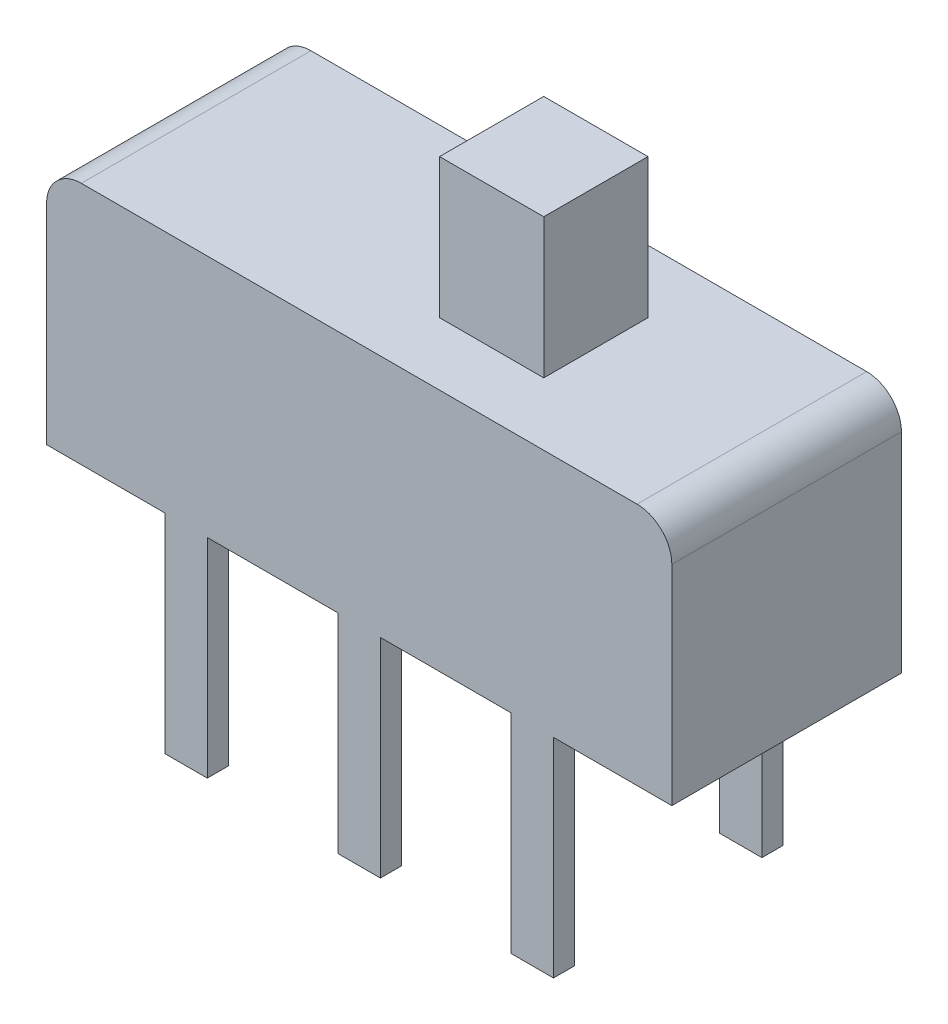
ISO-10303-21;
HEADER;
FILE_DESCRIPTION(('STEP AP214'),'2;1');
FILE_NAME('part.step','',(''),(''),'','','');
FILE_SCHEMA(('AUTOMOTIVE_DESIGN { 1 0 10303 214 1 1 1 1 }'));
ENDSEC;
DATA;
#1=APPLICATION_CONTEXT('core data for automotive mechanical design processes');
#2=APPLICATION_PROTOCOL_DEFINITION('international standard','automotive_design',2000,#1);
#3=PRODUCT_CONTEXT('',#1,'mechanical');
#4=PRODUCT('Part','Part','',(#3));
#5=PRODUCT_RELATED_PRODUCT_CATEGORY('part','',(#4));
#6=PRODUCT_DEFINITION_FORMATION('','',#4);
#7=PRODUCT_DEFINITION_CONTEXT('part definition',#1,'design');
#8=PRODUCT_DEFINITION('design','',#6,#7);
#9=PRODUCT_DEFINITION_SHAPE('','',#8);
#10=(LENGTH_UNIT() NAMED_UNIT(*) SI_UNIT(.MILLI.,.METRE.));
#11=(NAMED_UNIT(*) PLANE_ANGLE_UNIT() SI_UNIT($,.RADIAN.));
#12=(NAMED_UNIT(*) SI_UNIT($,.STERADIAN.) SOLID_ANGLE_UNIT());
#13=UNCERTAINTY_MEASURE_WITH_UNIT(LENGTH_MEASURE(1.E-05),#10,'distance_accuracy_value','');
#14=(GEOMETRIC_REPRESENTATION_CONTEXT(3) GLOBAL_UNCERTAINTY_ASSIGNED_CONTEXT((#13)) GLOBAL_UNIT_ASSIGNED_CONTEXT((#10,
#11,#12)) REPRESENTATION_CONTEXT('',''));
#15=CARTESIAN_POINT('',(0.,0.,0.));
#16=DIRECTION('',(0.,0.,1.));
#17=DIRECTION('',(1.,0.,0.));
#18=AXIS2_PLACEMENT_3D('',#15,#16,#17);
#19=CARTESIAN_POINT('',(-4.49579999999999,0.,-1.65099999999999));
#20=DIRECTION('',(0.,-1.,0.));
#21=DIRECTION('',(0.,0.,-1.));
#22=AXIS2_PLACEMENT_3D('',#19,#20,#21);
#23=PLANE('',#22);
#24=DIRECTION('',(0.,0.,1.));
#25=VECTOR('',#24,1.);
#26=CARTESIAN_POINT('',(-2.794,0.,-1.34620000000001));
#27=LINE('',#26,#25);
#28=CARTESIAN_POINT('',(-2.794,0.,-1.65099999999999));
#29=VERTEX_POINT('',#28);
#30=CARTESIAN_POINT('',(-2.794,0.,-1.34620000000001));
#31=VERTEX_POINT('',#30);
#32=EDGE_CURVE('E261',#29,#31,#27,.T.);
#33=ORIENTED_EDGE('',*,*,#32,.T.);
#34=DIRECTION('',(1.,0.,0.));
#35=VECTOR('',#34,1.);
#36=CARTESIAN_POINT('',(-2.794,0.,-1.34620000000001));
#37=LINE('',#36,#35);
#38=CARTESIAN_POINT('',(-2.1844,0.,-1.34620000000001));
#39=VERTEX_POINT('',#38);
#40=EDGE_CURVE('E277',#31,#39,#37,.T.);
#41=ORIENTED_EDGE('',*,*,#40,.T.);
#42=DIRECTION('',(0.,0.,-1.));
#43=VECTOR('',#42,1.);
#44=CARTESIAN_POINT('',(-2.1844,0.,-1.34620000000001));
#45=LINE('',#44,#43);
#46=CARTESIAN_POINT('',(-2.1844,0.,-1.65100000000001));
#47=VERTEX_POINT('',#46);
#48=EDGE_CURVE('E289',#39,#47,#45,.T.);
#49=ORIENTED_EDGE('',*,*,#48,.T.);
#50=DIRECTION('',(-1.,0.,0.));
#51=VECTOR('',#50,1.);
#52=CARTESIAN_POINT('',(-4.49579999999999,0.,-1.65099999999999));
#53=LINE('',#52,#51);
#54=CARTESIAN_POINT('',(-0.304800000000001,0.,-1.65099999999999));
#55=VERTEX_POINT('',#54);
#56=EDGE_CURVE('E480',#55,#47,#53,.T.);
#57=ORIENTED_EDGE('',*,*,#56,.F.);
#58=DIRECTION('',(0.,0.,1.));
#59=VECTOR('',#58,1.);
#60=CARTESIAN_POINT('',(-0.3048,0.,-1.34620000000001));
#61=LINE('',#60,#59);
#62=CARTESIAN_POINT('',(-0.3048,0.,-1.34620000000001));
#63=VERTEX_POINT('',#62);
#64=EDGE_CURVE('E266',#55,#63,#61,.T.);
#65=ORIENTED_EDGE('',*,*,#64,.T.);
#66=DIRECTION('',(1.,0.,0.));
#67=VECTOR('',#66,1.);
#68=CARTESIAN_POINT('',(-0.3048,0.,-1.34620000000001));
#69=LINE('',#68,#67);
#70=CARTESIAN_POINT('',(0.3048,0.,-1.34620000000001));
#71=VERTEX_POINT('',#70);
#72=EDGE_CURVE('E302',#63,#71,#69,.T.);
#73=ORIENTED_EDGE('',*,*,#72,.T.);
#74=DIRECTION('',(0.,0.,-1.));
#75=VECTOR('',#74,1.);
#76=CARTESIAN_POINT('',(0.3048,0.,-1.34620000000001));
#77=LINE('',#76,#75);
#78=CARTESIAN_POINT('',(0.3048,0.,-1.65100000000001));
#79=VERTEX_POINT('',#78);
#80=EDGE_CURVE('E314',#71,#79,#77,.T.);
#81=ORIENTED_EDGE('',*,*,#80,.T.);
#82=CARTESIAN_POINT('',(2.1844,0.,-1.65099999999999));
#83=VERTEX_POINT('',#82);
#84=EDGE_CURVE('E474',#83,#79,#53,.T.);
#85=ORIENTED_EDGE('',*,*,#84,.F.);
#86=DIRECTION('',(0.,0.,1.));
#87=VECTOR('',#86,1.);
#88=CARTESIAN_POINT('',(2.1844,0.,-1.34620000000001));
#89=LINE('',#88,#87);
#90=CARTESIAN_POINT('',(2.1844,0.,-1.34620000000001));
#91=VERTEX_POINT('',#90);
#92=EDGE_CURVE('E327',#83,#91,#89,.T.);
#93=ORIENTED_EDGE('',*,*,#92,.T.);
#94=DIRECTION('',(1.,0.,0.));
#95=VECTOR('',#94,1.);
#96=CARTESIAN_POINT('',(2.1844,0.,-1.34620000000001));
#97=LINE('',#96,#95);
#98=CARTESIAN_POINT('',(2.794,0.,-1.34620000000001));
#99=VERTEX_POINT('',#98);
#100=EDGE_CURVE('E332',#91,#99,#97,.T.);
#101=ORIENTED_EDGE('',*,*,#100,.T.);
#102=DIRECTION('',(0.,0.,-1.));
#103=VECTOR('',#102,1.);
#104=CARTESIAN_POINT('',(2.794,0.,-1.34620000000001));
#105=LINE('',#104,#103);
#106=CARTESIAN_POINT('',(2.794,0.,-1.65100000000001));
#107=VERTEX_POINT('',#106);
#108=EDGE_CURVE('E344',#99,#107,#105,.T.);
#109=ORIENTED_EDGE('',*,*,#108,.T.);
#110=CARTESIAN_POINT('',(4.4958,0.,-1.65099999999999));
#111=VERTEX_POINT('',#110);
#112=EDGE_CURVE('E471',#111,#107,#53,.T.);
#113=ORIENTED_EDGE('',*,*,#112,.F.);
#114=DIRECTION('',(0.,0.,-1.));
#115=VECTOR('',#114,1.);
#116=CARTESIAN_POINT('',(4.49580000000001,0.,1.65100000000001));
#117=LINE('',#116,#115);
#118=CARTESIAN_POINT('',(4.49580000000001,0.,1.65100000000001));
#119=VERTEX_POINT('',#118);
#120=EDGE_CURVE('E451',#119,#111,#117,.T.);
#121=ORIENTED_EDGE('',*,*,#120,.F.);
#122=DIRECTION('',(1.,0.,0.));
#123=VECTOR('',#122,1.);
#124=CARTESIAN_POINT('',(-4.49579999999999,0.,1.65100000000001));
#125=LINE('',#124,#123);
#126=CARTESIAN_POINT('',(2.794,0.,1.65100000000001));
#127=VERTEX_POINT('',#126);
#128=EDGE_CURVE('E444',#127,#119,#125,.T.);
#129=ORIENTED_EDGE('',*,*,#128,.F.);
#130=DIRECTION('',(0.,0.,1.));
#131=VECTOR('',#130,1.);
#132=CARTESIAN_POINT('',(2.794,0.,1.34620000000001));
#133=LINE('',#132,#131);
#134=CARTESIAN_POINT('',(2.794,0.,1.34620000000001));
#135=VERTEX_POINT('',#134);
#136=EDGE_CURVE('E415',#135,#127,#133,.T.);
#137=ORIENTED_EDGE('',*,*,#136,.F.);
#138=DIRECTION('',(1.,0.,0.));
#139=VECTOR('',#138,1.);
#140=CARTESIAN_POINT('',(2.1844,0.,1.34620000000001));
#141=LINE('',#140,#139);
#142=CARTESIAN_POINT('',(2.1844,0.,1.34620000000001));
#143=VERTEX_POINT('',#142);
#144=EDGE_CURVE('E422',#143,#135,#141,.T.);
#145=ORIENTED_EDGE('',*,*,#144,.F.);
#146=DIRECTION('',(0.,0.,-1.));
#147=VECTOR('',#146,1.);
#148=CARTESIAN_POINT('',(2.1844,0.,1.34620000000001));
#149=LINE('',#148,#147);
#150=CARTESIAN_POINT('',(2.1844,0.,1.65100000000001));
#151=VERTEX_POINT('',#150);
#152=EDGE_CURVE('E410',#151,#143,#149,.T.);
#153=ORIENTED_EDGE('',*,*,#152,.F.);
#154=CARTESIAN_POINT('',(0.3048,0.,1.65100000000001));
#155=VERTEX_POINT('',#154);
#156=EDGE_CURVE('E440',#155,#151,#125,.T.);
#157=ORIENTED_EDGE('',*,*,#156,.F.);
#158=DIRECTION('',(0.,0.,1.));
#159=VECTOR('',#158,1.);
#160=CARTESIAN_POINT('',(0.3048,0.,1.34620000000001));
#161=LINE('',#160,#159);
#162=CARTESIAN_POINT('',(0.3048,0.,1.34620000000001));
#163=VERTEX_POINT('',#162);
#164=EDGE_CURVE('E388',#163,#155,#161,.T.);
#165=ORIENTED_EDGE('',*,*,#164,.F.);
#166=DIRECTION('',(1.,0.,0.));
#167=VECTOR('',#166,1.);
#168=CARTESIAN_POINT('',(-0.3048,0.,1.34620000000001));
#169=LINE('',#168,#167);
#170=CARTESIAN_POINT('',(-0.3048,0.,1.34620000000001));
#171=VERTEX_POINT('',#170);
#172=EDGE_CURVE('E397',#171,#163,#169,.T.);
#173=ORIENTED_EDGE('',*,*,#172,.F.);
#174=DIRECTION('',(0.,0.,-1.));
#175=VECTOR('',#174,1.);
#176=CARTESIAN_POINT('',(-0.3048,0.,1.34620000000001));
#177=LINE('',#176,#175);
#178=CARTESIAN_POINT('',(-0.3048,0.,1.65100000000001));
#179=VERTEX_POINT('',#178);
#180=EDGE_CURVE('E383',#179,#171,#177,.T.);
#181=ORIENTED_EDGE('',*,*,#180,.F.);
#182=CARTESIAN_POINT('',(-2.1844,0.,1.65100000000001));
#183=VERTEX_POINT('',#182);
#184=EDGE_CURVE('E443',#183,#179,#125,.T.);
#185=ORIENTED_EDGE('',*,*,#184,.F.);
#186=DIRECTION('',(0.,0.,1.));
#187=VECTOR('',#186,1.);
#188=CARTESIAN_POINT('',(-2.1844,0.,1.34620000000001));
#189=LINE('',#188,#187);
#190=CARTESIAN_POINT('',(-2.1844,0.,1.34620000000001));
#191=VERTEX_POINT('',#190);
#192=EDGE_CURVE('E362',#191,#183,#189,.T.);
#193=ORIENTED_EDGE('',*,*,#192,.F.);
#194=DIRECTION('',(1.,0.,0.));
#195=VECTOR('',#194,1.);
#196=CARTESIAN_POINT('',(-2.794,0.,1.34620000000001));
#197=LINE('',#196,#195);
#198=CARTESIAN_POINT('',(-2.794,0.,1.34620000000001));
#199=VERTEX_POINT('',#198);
#200=EDGE_CURVE('E371',#199,#191,#197,.T.);
#201=ORIENTED_EDGE('',*,*,#200,.F.);
#202=DIRECTION('',(0.,0.,-1.));
#203=VECTOR('',#202,1.);
#204=CARTESIAN_POINT('',(-2.794,0.,1.34620000000001));
#205=LINE('',#204,#203);
#206=CARTESIAN_POINT('',(-2.794,0.,1.65100000000001));
#207=VERTEX_POINT('',#206);
#208=EDGE_CURVE('E357',#207,#199,#205,.T.);
#209=ORIENTED_EDGE('',*,*,#208,.F.);
#210=CARTESIAN_POINT('',(-4.49579999999999,0.,1.65100000000001));
#211=VERTEX_POINT('',#210);
#212=EDGE_CURVE('E459',#211,#207,#125,.T.);
#213=ORIENTED_EDGE('',*,*,#212,.F.);
#214=DIRECTION('',(0.,0.,1.));
#215=VECTOR('',#214,1.);
#216=CARTESIAN_POINT('',(-4.49579999999999,0.,1.65100000000001));
#217=LINE('',#216,#215);
#218=CARTESIAN_POINT('',(-4.49579999999999,0.,-1.65099999999999));
#219=VERTEX_POINT('',#218);
#220=EDGE_CURVE('E449',#219,#211,#217,.T.);
#221=ORIENTED_EDGE('',*,*,#220,.F.);
#222=EDGE_CURVE('E475',#29,#219,#53,.T.);
#223=ORIENTED_EDGE('',*,*,#222,.F.);
#224=EDGE_LOOP('',(#33,#41,#49,#57,#65,#73,#81,#85,#93,#101,#109,#113,#121,#129,#137,#145,#153,
#157,#165,#173,#181,#185,#193,#201,#209,#213,#221,#223));
#225=FACE_BOUND('',#224,.T.);
#226=ADVANCED_FACE('F34',(#225),#23,.T.);
#227=CARTESIAN_POINT('',(-4.49579999999999,3.5052,-1.65099999999999));
#228=DIRECTION('',(0.,-1.,0.));
#229=DIRECTION('',(0.,0.,-1.));
#230=AXIS2_PLACEMENT_3D('',#227,#228,#229);
#231=PLANE('',#230);
#232=DIRECTION('',(1.,0.,0.));
#233=VECTOR('',#232,1.);
#234=CARTESIAN_POINT('',(-4.49579999999999,3.5052,1.65100000000001));
#235=LINE('',#234,#233);
#236=CARTESIAN_POINT('',(-3.9958,3.5052,1.65100000000001));
#237=VERTEX_POINT('',#236);
#238=CARTESIAN_POINT('',(3.99580000000001,3.5052,1.65100000000001));
#239=VERTEX_POINT('',#238);
#240=EDGE_CURVE('E473',#237,#239,#235,.T.);
#241=ORIENTED_EDGE('',*,*,#240,.T.);
#242=DIRECTION('',(0.,0.,-1.));
#243=VECTOR('',#242,1.);
#244=CARTESIAN_POINT('',(3.9958,3.5052,-1.651));
#245=LINE('',#244,#243);
#246=CARTESIAN_POINT('',(3.9958,3.5052,-1.65099999999999));
#247=VERTEX_POINT('',#246);
#248=EDGE_CURVE('E544',#239,#247,#245,.T.);
#249=ORIENTED_EDGE('',*,*,#248,.T.);
#250=DIRECTION('',(-1.,0.,0.));
#251=VECTOR('',#250,1.);
#252=CARTESIAN_POINT('',(-4.49579999999999,3.5052,-1.65099999999999));
#253=LINE('',#252,#251);
#254=CARTESIAN_POINT('',(-3.9958,3.5052,-1.65099999999999));
#255=VERTEX_POINT('',#254);
#256=EDGE_CURVE('E470',#247,#255,#253,.T.);
#257=ORIENTED_EDGE('',*,*,#256,.T.);
#258=DIRECTION('',(0.,0.,1.));
#259=VECTOR('',#258,1.);
#260=CARTESIAN_POINT('',(-3.9958,3.5052,-1.65099999999999));
#261=LINE('',#260,#259);
#262=EDGE_CURVE('E464',#255,#237,#261,.T.);
#263=ORIENTED_EDGE('',*,*,#262,.T.);
#264=EDGE_LOOP('',(#241,#249,#257,#263));
#265=FACE_BOUND('',#264,.T.);
#266=DIRECTION('',(0.,0.,1.));
#267=VECTOR('',#266,1.);
#268=CARTESIAN_POINT('',(0.254,3.5052,0.749299999999999));
#269=LINE('',#268,#267);
#270=CARTESIAN_POINT('',(0.254,3.5052,-0.7493));
#271=VERTEX_POINT('',#270);
#272=CARTESIAN_POINT('',(0.253999999999999,3.5052,0.749299999999999));
#273=VERTEX_POINT('',#272);
#274=EDGE_CURVE('E641',#271,#273,#269,.T.);
#275=ORIENTED_EDGE('',*,*,#274,.F.);
#276=DIRECTION('',(-1.,0.,0.));
#277=VECTOR('',#276,1.);
#278=CARTESIAN_POINT('',(0.254,3.5052,-0.7493));
#279=LINE('',#278,#277);
#280=CARTESIAN_POINT('',(1.7526,3.5052,-0.7493));
#281=VERTEX_POINT('',#280);
#282=EDGE_CURVE('E649',#281,#271,#279,.T.);
#283=ORIENTED_EDGE('',*,*,#282,.F.);
#284=DIRECTION('',(0.,0.,-1.));
#285=VECTOR('',#284,1.);
#286=CARTESIAN_POINT('',(1.7526,3.5052,0.7493));
#287=LINE('',#286,#285);
#288=CARTESIAN_POINT('',(1.7526,3.5052,0.7493));
#289=VERTEX_POINT('',#288);
#290=EDGE_CURVE('E657',#289,#281,#287,.T.);
#291=ORIENTED_EDGE('',*,*,#290,.F.);
#292=DIRECTION('',(1.,0.,0.));
#293=VECTOR('',#292,1.);
#294=CARTESIAN_POINT('',(0.254,3.5052,0.749299999999999));
#295=LINE('',#294,#293);
#296=EDGE_CURVE('E642',#273,#289,#295,.T.);
#297=ORIENTED_EDGE('',*,*,#296,.F.);
#298=EDGE_LOOP('',(#275,#283,#291,#297));
#299=FACE_BOUND('',#298,.T.);
#300=ADVANCED_FACE('F541',(#265,#299),#231,.F.);
#301=CARTESIAN_POINT('',(-4.49579999999999,3.5052,1.65100000000001));
#302=DIRECTION('',(1.,0.,0.));
#303=DIRECTION('',(0.,0.,-1.));
#304=AXIS2_PLACEMENT_3D('',#301,#302,#303);
#305=PLANE('',#304);
#306=DIRECTION('',(0.,-1.,0.));
#307=VECTOR('',#306,1.);
#308=CARTESIAN_POINT('',(-4.49579999999999,3.5052,1.65100000000001));
#309=LINE('',#308,#307);
#310=CARTESIAN_POINT('',(-4.49579999999999,3.0052,1.65100000000001));
#311=VERTEX_POINT('',#310);
#312=EDGE_CURVE('E462',#311,#211,#309,.T.);
#313=ORIENTED_EDGE('',*,*,#312,.F.);
#314=DIRECTION('',(0.,0.,1.));
#315=VECTOR('',#314,1.);
#316=CARTESIAN_POINT('',(-4.49579999999999,3.0052,1.65100000000001));
#317=LINE('',#316,#315);
#318=CARTESIAN_POINT('',(-4.49579999999999,3.0052,-1.65099999999999));
#319=VERTEX_POINT('',#318);
#320=EDGE_CURVE('E11',#311,#319,#317,.F.);
#321=ORIENTED_EDGE('',*,*,#320,.T.);
#322=DIRECTION('',(0.,-1.,0.));
#323=VECTOR('',#322,1.);
#324=CARTESIAN_POINT('',(-4.49579999999999,3.5052,-1.65099999999999));
#325=LINE('',#324,#323);
#326=EDGE_CURVE('E469',#319,#219,#325,.T.);
#327=ORIENTED_EDGE('',*,*,#326,.T.);
#328=ORIENTED_EDGE('',*,*,#220,.T.);
#329=EDGE_LOOP('',(#313,#321,#327,#328));
#330=FACE_BOUND('',#329,.T.);
#331=ADVANCED_FACE('F571',(#330),#305,.F.);
#332=CARTESIAN_POINT('',(-4.49579999999999,3.5052,1.65100000000001));
#333=DIRECTION('',(0.,0.,-1.));
#334=DIRECTION('',(-1.,0.,0.));
#335=AXIS2_PLACEMENT_3D('',#332,#333,#334);
#336=PLANE('',#335);
#337=DIRECTION('',(0.,-1.,0.));
#338=VECTOR('',#337,1.);
#339=CARTESIAN_POINT('',(4.49580000000001,3.5052,1.65100000000001));
#340=LINE('',#339,#338);
#341=CARTESIAN_POINT('',(4.49580000000001,3.0052,1.65100000000001));
#342=VERTEX_POINT('',#341);
#343=EDGE_CURVE('E465',#342,#119,#340,.T.);
#344=ORIENTED_EDGE('',*,*,#343,.F.);
#345=CARTESIAN_POINT('',(3.99580000000001,3.0052,1.65100000000001));
#346=DIRECTION('',(0.,0.,-1.));
#347=DIRECTION('',(-1.,0.,0.));
#348=AXIS2_PLACEMENT_3D('',#345,#346,#347);
#349=CIRCLE('',#348,0.5);
#350=EDGE_CURVE('E42',#342,#239,#349,.F.);
#351=ORIENTED_EDGE('',*,*,#350,.T.);
#352=ORIENTED_EDGE('',*,*,#240,.F.);
#353=CARTESIAN_POINT('',(-3.9958,3.0052,1.65100000000001));
#354=DIRECTION('',(0.,0.,-1.));
#355=DIRECTION('',(-1.,0.,0.));
#356=AXIS2_PLACEMENT_3D('',#353,#354,#355);
#357=CIRCLE('',#356,0.5);
#358=EDGE_CURVE('E49',#237,#311,#357,.F.);
#359=ORIENTED_EDGE('',*,*,#358,.T.);
#360=ORIENTED_EDGE('',*,*,#312,.T.);
#361=ORIENTED_EDGE('',*,*,#212,.T.);
#362=DIRECTION('',(0.,1.,0.));
#363=VECTOR('',#362,1.);
#364=CARTESIAN_POINT('',(-2.794,-2.9972,1.65100000000001));
#365=LINE('',#364,#363);
#366=CARTESIAN_POINT('',(-2.794,-2.9972,1.65100000000001));
#367=VERTEX_POINT('',#366);
#368=EDGE_CURVE('E368',#367,#207,#365,.T.);
#369=ORIENTED_EDGE('',*,*,#368,.F.);
#370=DIRECTION('',(-1.,0.,0.));
#371=VECTOR('',#370,1.);
#372=CARTESIAN_POINT('',(-2.794,-2.9972,1.65100000000001));
#373=LINE('',#372,#371);
#374=CARTESIAN_POINT('',(-2.1844,-2.9972,1.65100000000001));
#375=VERTEX_POINT('',#374);
#376=EDGE_CURVE('E366',#375,#367,#373,.T.);
#377=ORIENTED_EDGE('',*,*,#376,.F.);
#378=DIRECTION('',(0.,1.,0.));
#379=VECTOR('',#378,1.);
#380=CARTESIAN_POINT('',(-2.1844,-2.9972,1.65100000000001));
#381=LINE('',#380,#379);
#382=EDGE_CURVE('E376',#375,#183,#381,.T.);
#383=ORIENTED_EDGE('',*,*,#382,.T.);
#384=ORIENTED_EDGE('',*,*,#184,.T.);
#385=DIRECTION('',(0.,1.,0.));
#386=VECTOR('',#385,1.);
#387=CARTESIAN_POINT('',(-0.3048,-2.9972,1.65100000000001));
#388=LINE('',#387,#386);
#389=CARTESIAN_POINT('',(-0.3048,-2.9972,1.65100000000001));
#390=VERTEX_POINT('',#389);
#391=EDGE_CURVE('E394',#390,#179,#388,.T.);
#392=ORIENTED_EDGE('',*,*,#391,.F.);
#393=DIRECTION('',(-1.,0.,0.));
#394=VECTOR('',#393,1.);
#395=CARTESIAN_POINT('',(-0.3048,-2.9972,1.65100000000001));
#396=LINE('',#395,#394);
#397=CARTESIAN_POINT('',(0.3048,-2.9972,1.65100000000001));
#398=VERTEX_POINT('',#397);
#399=EDGE_CURVE('E392',#398,#390,#396,.T.);
#400=ORIENTED_EDGE('',*,*,#399,.F.);
#401=DIRECTION('',(0.,1.,0.));
#402=VECTOR('',#401,1.);
#403=CARTESIAN_POINT('',(0.3048,-2.9972,1.65100000000001));
#404=LINE('',#403,#402);
#405=EDGE_CURVE('E403',#398,#155,#404,.T.);
#406=ORIENTED_EDGE('',*,*,#405,.T.);
#407=ORIENTED_EDGE('',*,*,#156,.T.);
#408=DIRECTION('',(0.,1.,0.));
#409=VECTOR('',#408,1.);
#410=CARTESIAN_POINT('',(2.1844,-2.9972,1.65100000000001));
#411=LINE('',#410,#409);
#412=CARTESIAN_POINT('',(2.1844,-2.9972,1.65100000000001));
#413=VERTEX_POINT('',#412);
#414=EDGE_CURVE('E421',#413,#151,#411,.T.);
#415=ORIENTED_EDGE('',*,*,#414,.F.);
#416=DIRECTION('',(-1.,0.,0.));
#417=VECTOR('',#416,1.);
#418=CARTESIAN_POINT('',(2.1844,-2.9972,1.65100000000001));
#419=LINE('',#418,#417);
#420=CARTESIAN_POINT('',(2.794,-2.9972,1.65100000000001));
#421=VERTEX_POINT('',#420);
#422=EDGE_CURVE('E419',#421,#413,#419,.T.);
#423=ORIENTED_EDGE('',*,*,#422,.F.);
#424=DIRECTION('',(0.,1.,0.));
#425=VECTOR('',#424,1.);
#426=CARTESIAN_POINT('',(2.794,-2.9972,1.65100000000001));
#427=LINE('',#426,#425);
#428=EDGE_CURVE('E435',#421,#127,#427,.T.);
#429=ORIENTED_EDGE('',*,*,#428,.T.);
#430=ORIENTED_EDGE('',*,*,#128,.T.);
#431=EDGE_LOOP('',(#344,#351,#352,#359,#360,#361,#369,#377,#383,#384,#392,#400,#406,#407,#415,
#423,#429,#430));
#432=FACE_BOUND('',#431,.T.);
#433=ADVANCED_FACE('F556',(#432),#336,.F.);
#434=CARTESIAN_POINT('',(4.49580000000001,3.5052,1.65100000000001));
#435=DIRECTION('',(-1.,0.,0.));
#436=DIRECTION('',(0.,0.,1.));
#437=AXIS2_PLACEMENT_3D('',#434,#435,#436);
#438=PLANE('',#437);
#439=DIRECTION('',(0.,-1.,0.));
#440=VECTOR('',#439,1.);
#441=CARTESIAN_POINT('',(4.4958,3.5052,-1.65099999999999));
#442=LINE('',#441,#440);
#443=CARTESIAN_POINT('',(4.4958,3.0052,-1.65099999999999));
#444=VERTEX_POINT('',#443);
#445=EDGE_CURVE('E467',#444,#111,#442,.T.);
#446=ORIENTED_EDGE('',*,*,#445,.F.);
#447=DIRECTION('',(0.,0.,-1.));
#448=VECTOR('',#447,1.);
#449=CARTESIAN_POINT('',(4.49580000000001,3.0052,1.65100000000001));
#450=LINE('',#449,#448);
#451=EDGE_CURVE('E57',#444,#342,#450,.F.);
#452=ORIENTED_EDGE('',*,*,#451,.T.);
#453=ORIENTED_EDGE('',*,*,#343,.T.);
#454=ORIENTED_EDGE('',*,*,#120,.T.);
#455=EDGE_LOOP('',(#446,#452,#453,#454));
#456=FACE_BOUND('',#455,.T.);
#457=ADVANCED_FACE('F485',(#456),#438,.F.);
#458=CARTESIAN_POINT('',(-4.49579999999999,3.5052,-1.65099999999999));
#459=DIRECTION('',(0.,0.,1.));
#460=DIRECTION('',(1.,0.,0.));
#461=AXIS2_PLACEMENT_3D('',#458,#459,#460);
#462=PLANE('',#461);
#463=ORIENTED_EDGE('',*,*,#256,.F.);
#464=CARTESIAN_POINT('',(3.9958,3.0052,-1.65099999999999));
#465=DIRECTION('',(0.,0.,1.));
#466=DIRECTION('',(1.,0.,0.));
#467=AXIS2_PLACEMENT_3D('',#464,#465,#466);
#468=CIRCLE('',#467,0.5);
#469=EDGE_CURVE('E552',#247,#444,#468,.F.);
#470=ORIENTED_EDGE('',*,*,#469,.T.);
#471=ORIENTED_EDGE('',*,*,#445,.T.);
#472=ORIENTED_EDGE('',*,*,#112,.T.);
#473=DIRECTION('',(0.,1.,0.));
#474=VECTOR('',#473,1.);
#475=CARTESIAN_POINT('',(2.794,-2.9972,-1.65100000000001));
#476=LINE('',#475,#474);
#477=CARTESIAN_POINT('',(2.794,-2.9972,-1.65100000000001));
#478=VERTEX_POINT('',#477);
#479=EDGE_CURVE('E352',#478,#107,#476,.T.);
#480=ORIENTED_EDGE('',*,*,#479,.F.);
#481=DIRECTION('',(-1.,0.,0.));
#482=VECTOR('',#481,1.);
#483=CARTESIAN_POINT('',(2.1844,-2.9972,-1.65100000000001));
#484=LINE('',#483,#482);
#485=CARTESIAN_POINT('',(2.1844,-2.9972,-1.65100000000001));
#486=VERTEX_POINT('',#485);
#487=EDGE_CURVE('E331',#478,#486,#484,.T.);
#488=ORIENTED_EDGE('',*,*,#487,.T.);
#489=DIRECTION('',(0.,1.,0.));
#490=VECTOR('',#489,1.);
#491=CARTESIAN_POINT('',(2.1844,-2.9972,-1.65100000000001));
#492=LINE('',#491,#490);
#493=EDGE_CURVE('E354',#486,#83,#492,.T.);
#494=ORIENTED_EDGE('',*,*,#493,.T.);
#495=ORIENTED_EDGE('',*,*,#84,.T.);
#496=DIRECTION('',(0.,1.,0.));
#497=VECTOR('',#496,1.);
#498=CARTESIAN_POINT('',(0.3048,-2.9972,-1.65100000000001));
#499=LINE('',#498,#497);
#500=CARTESIAN_POINT('',(0.3048,-2.9972,-1.65100000000001));
#501=VERTEX_POINT('',#500);
#502=EDGE_CURVE('E322',#501,#79,#499,.T.);
#503=ORIENTED_EDGE('',*,*,#502,.F.);
#504=DIRECTION('',(-1.,0.,0.));
#505=VECTOR('',#504,1.);
#506=CARTESIAN_POINT('',(-0.3048,-2.9972,-1.65100000000001));
#507=LINE('',#506,#505);
#508=CARTESIAN_POINT('',(-0.3048,-2.9972,-1.65100000000001));
#509=VERTEX_POINT('',#508);
#510=EDGE_CURVE('E301',#501,#509,#507,.T.);
#511=ORIENTED_EDGE('',*,*,#510,.T.);
#512=DIRECTION('',(0.,1.,0.));
#513=VECTOR('',#512,1.);
#514=CARTESIAN_POINT('',(-0.3048,-2.9972,-1.65100000000001));
#515=LINE('',#514,#513);
#516=EDGE_CURVE('E324',#509,#55,#515,.T.);
#517=ORIENTED_EDGE('',*,*,#516,.T.);
#518=ORIENTED_EDGE('',*,*,#56,.T.);
#519=DIRECTION('',(0.,1.,0.));
#520=VECTOR('',#519,1.);
#521=CARTESIAN_POINT('',(-2.1844,-2.9972,-1.65100000000001));
#522=LINE('',#521,#520);
#523=CARTESIAN_POINT('',(-2.1844,-2.9972,-1.65100000000001));
#524=VERTEX_POINT('',#523);
#525=EDGE_CURVE('E267',#524,#47,#522,.T.);
#526=ORIENTED_EDGE('',*,*,#525,.F.);
#527=DIRECTION('',(-1.,0.,0.));
#528=VECTOR('',#527,1.);
#529=CARTESIAN_POINT('',(-2.794,-2.9972,-1.65100000000001));
#530=LINE('',#529,#528);
#531=CARTESIAN_POINT('',(-2.794,-2.9972,-1.65100000000001));
#532=VERTEX_POINT('',#531);
#533=EDGE_CURVE('E273',#524,#532,#530,.T.);
#534=ORIENTED_EDGE('',*,*,#533,.T.);
#535=DIRECTION('',(0.,1.,0.));
#536=VECTOR('',#535,1.);
#537=CARTESIAN_POINT('',(-2.794,-2.9972,-1.65100000000001));
#538=LINE('',#537,#536);
#539=EDGE_CURVE('E255',#532,#29,#538,.T.);
#540=ORIENTED_EDGE('',*,*,#539,.T.);
#541=ORIENTED_EDGE('',*,*,#222,.T.);
#542=ORIENTED_EDGE('',*,*,#326,.F.);
#543=CARTESIAN_POINT('',(-3.9958,3.0052,-1.65099999999999));
#544=DIRECTION('',(0.,0.,1.));
#545=DIRECTION('',(1.,0.,0.));
#546=AXIS2_PLACEMENT_3D('',#543,#544,#545);
#547=CIRCLE('',#546,0.5);
#548=EDGE_CURVE('E548',#319,#255,#547,.F.);
#549=ORIENTED_EDGE('',*,*,#548,.T.);
#550=EDGE_LOOP('',(#463,#470,#471,#472,#480,#488,#494,#495,#503,#511,#517,#518,#526,#534,#540,
#541,#542,#549));
#551=FACE_BOUND('',#550,.T.);
#552=ADVANCED_FACE('F280',(#551),#462,.F.);
#553=CARTESIAN_POINT('',(0.254,5.5118,0.749299999999999));
#554=DIRECTION('',(1.,0.,0.));
#555=DIRECTION('',(0.,0.,-1.));
#556=AXIS2_PLACEMENT_3D('',#553,#554,#555);
#557=PLANE('',#556);
#558=ORIENTED_EDGE('',*,*,#274,.T.);
#559=DIRECTION('',(0.,-1.,0.));
#560=VECTOR('',#559,1.);
#561=CARTESIAN_POINT('',(0.254,5.5118,0.749299999999999));
#562=LINE('',#561,#560);
#563=CARTESIAN_POINT('',(0.254,5.5118,0.749299999999999));
#564=VERTEX_POINT('',#563);
#565=EDGE_CURVE('E524',#564,#273,#562,.T.);
#566=ORIENTED_EDGE('',*,*,#565,.F.);
#567=DIRECTION('',(0.,0.,1.));
#568=VECTOR('',#567,1.);
#569=CARTESIAN_POINT('',(0.254,5.5118,0.749299999999999));
#570=LINE('',#569,#568);
#571=CARTESIAN_POINT('',(0.254,5.5118,-0.7493));
#572=VERTEX_POINT('',#571);
#573=EDGE_CURVE('E645',#572,#564,#570,.T.);
#574=ORIENTED_EDGE('',*,*,#573,.F.);
#575=DIRECTION('',(0.,-1.,0.));
#576=VECTOR('',#575,1.);
#577=CARTESIAN_POINT('',(0.254,5.5118,-0.7493));
#578=LINE('',#577,#576);
#579=EDGE_CURVE('E654',#572,#271,#578,.T.);
#580=ORIENTED_EDGE('',*,*,#579,.T.);
#581=EDGE_LOOP('',(#558,#566,#574,#580));
#582=FACE_BOUND('',#581,.T.);
#583=ADVANCED_FACE('F577',(#582),#557,.F.);
#584=CARTESIAN_POINT('',(0.254,5.5118,0.749299999999999));
#585=DIRECTION('',(0.,0.,-1.));
#586=DIRECTION('',(-1.,0.,0.));
#587=AXIS2_PLACEMENT_3D('',#584,#585,#586);
#588=PLANE('',#587);
#589=ORIENTED_EDGE('',*,*,#296,.T.);
#590=DIRECTION('',(0.,-1.,0.));
#591=VECTOR('',#590,1.);
#592=CARTESIAN_POINT('',(1.7526,5.5118,0.7493));
#593=LINE('',#592,#591);
#594=CARTESIAN_POINT('',(1.7526,5.5118,0.7493));
#595=VERTEX_POINT('',#594);
#596=EDGE_CURVE('E526',#595,#289,#593,.T.);
#597=ORIENTED_EDGE('',*,*,#596,.F.);
#598=DIRECTION('',(1.,0.,0.));
#599=VECTOR('',#598,1.);
#600=CARTESIAN_POINT('',(0.254,5.5118,0.749299999999999));
#601=LINE('',#600,#599);
#602=EDGE_CURVE('E648',#564,#595,#601,.T.);
#603=ORIENTED_EDGE('',*,*,#602,.F.);
#604=ORIENTED_EDGE('',*,*,#565,.T.);
#605=EDGE_LOOP('',(#589,#597,#603,#604));
#606=FACE_BOUND('',#605,.T.);
#607=ADVANCED_FACE('F673',(#606),#588,.F.);
#608=CARTESIAN_POINT('',(1.7526,5.5118,0.7493));
#609=DIRECTION('',(-1.,0.,0.));
#610=DIRECTION('',(0.,0.,1.));
#611=AXIS2_PLACEMENT_3D('',#608,#609,#610);
#612=PLANE('',#611);
#613=ORIENTED_EDGE('',*,*,#290,.T.);
#614=DIRECTION('',(0.,-1.,0.));
#615=VECTOR('',#614,1.);
#616=CARTESIAN_POINT('',(1.7526,5.5118,-0.7493));
#617=LINE('',#616,#615);
#618=CARTESIAN_POINT('',(1.7526,5.5118,-0.7493));
#619=VERTEX_POINT('',#618);
#620=EDGE_CURVE('E533',#619,#281,#617,.T.);
#621=ORIENTED_EDGE('',*,*,#620,.F.);
#622=DIRECTION('',(0.,0.,-1.));
#623=VECTOR('',#622,1.);
#624=CARTESIAN_POINT('',(1.7526,5.5118,0.7493));
#625=LINE('',#624,#623);
#626=EDGE_CURVE('E651',#595,#619,#625,.T.);
#627=ORIENTED_EDGE('',*,*,#626,.F.);
#628=ORIENTED_EDGE('',*,*,#596,.T.);
#629=EDGE_LOOP('',(#613,#621,#627,#628));
#630=FACE_BOUND('',#629,.T.);
#631=ADVANCED_FACE('F671',(#630),#612,.F.);
#632=CARTESIAN_POINT('',(0.254,5.5118,-0.7493));
#633=DIRECTION('',(0.,0.,1.));
#634=DIRECTION('',(1.,0.,0.));
#635=AXIS2_PLACEMENT_3D('',#632,#633,#634);
#636=PLANE('',#635);
#637=ORIENTED_EDGE('',*,*,#282,.T.);
#638=ORIENTED_EDGE('',*,*,#579,.F.);
#639=DIRECTION('',(-1.,0.,0.));
#640=VECTOR('',#639,1.);
#641=CARTESIAN_POINT('',(0.254,5.5118,-0.7493));
#642=LINE('',#641,#640);
#643=EDGE_CURVE('E653',#619,#572,#642,.T.);
#644=ORIENTED_EDGE('',*,*,#643,.F.);
#645=ORIENTED_EDGE('',*,*,#620,.T.);
#646=EDGE_LOOP('',(#637,#638,#644,#645));
#647=FACE_BOUND('',#646,.T.);
#648=ADVANCED_FACE('F667',(#647),#636,.F.);
#649=CARTESIAN_POINT('',(0.254,5.5118,-0.7493));
#650=DIRECTION('',(0.,-1.,0.));
#651=DIRECTION('',(0.,0.,-1.));
#652=AXIS2_PLACEMENT_3D('',#649,#650,#651);
#653=PLANE('',#652);
#654=ORIENTED_EDGE('',*,*,#573,.T.);
#655=ORIENTED_EDGE('',*,*,#602,.T.);
#656=ORIENTED_EDGE('',*,*,#626,.T.);
#657=ORIENTED_EDGE('',*,*,#643,.T.);
#658=EDGE_LOOP('',(#654,#655,#656,#657));
#659=FACE_BOUND('',#658,.T.);
#660=ADVANCED_FACE('F676',(#659),#653,.F.);
#661=CARTESIAN_POINT('',(2.1844,-2.9972,1.34620000000001));
#662=DIRECTION('',(1.,0.,0.));
#663=DIRECTION('',(0.,0.,-1.));
#664=AXIS2_PLACEMENT_3D('',#661,#662,#663);
#665=PLANE('',#664);
#666=ORIENTED_EDGE('',*,*,#152,.T.);
#667=DIRECTION('',(0.,1.,0.));
#668=VECTOR('',#667,1.);
#669=CARTESIAN_POINT('',(2.1844,-2.9972,1.34620000000001));
#670=LINE('',#669,#668);
#671=CARTESIAN_POINT('',(2.1844,-2.9972,1.34620000000001));
#672=VERTEX_POINT('',#671);
#673=EDGE_CURVE('E630',#672,#143,#670,.T.);
#674=ORIENTED_EDGE('',*,*,#673,.F.);
#675=DIRECTION('',(0.,0.,-1.));
#676=VECTOR('',#675,1.);
#677=CARTESIAN_POINT('',(2.1844,-2.9972,1.34620000000001));
#678=LINE('',#677,#676);
#679=EDGE_CURVE('E411',#413,#672,#678,.T.);
#680=ORIENTED_EDGE('',*,*,#679,.F.);
#681=ORIENTED_EDGE('',*,*,#414,.T.);
#682=EDGE_LOOP('',(#666,#674,#680,#681));
#683=FACE_BOUND('',#682,.T.);
#684=ADVANCED_FACE('F627',(#683),#665,.F.);
#685=CARTESIAN_POINT('',(2.1844,-2.9972,1.34620000000001));
#686=DIRECTION('',(0.,0.,1.));
#687=DIRECTION('',(1.,0.,0.));
#688=AXIS2_PLACEMENT_3D('',#685,#686,#687);
#689=PLANE('',#688);
#690=ORIENTED_EDGE('',*,*,#144,.T.);
#691=DIRECTION('',(0.,1.,0.));
#692=VECTOR('',#691,1.);
#693=CARTESIAN_POINT('',(2.794,-2.9972,1.34620000000001));
#694=LINE('',#693,#692);
#695=CARTESIAN_POINT('',(2.794,-2.9972,1.34620000000001));
#696=VERTEX_POINT('',#695);
#697=EDGE_CURVE('E427',#696,#135,#694,.T.);
#698=ORIENTED_EDGE('',*,*,#697,.F.);
#699=DIRECTION('',(1.,0.,0.));
#700=VECTOR('',#699,1.);
#701=CARTESIAN_POINT('',(2.1844,-2.9972,1.34620000000001));
#702=LINE('',#701,#700);
#703=EDGE_CURVE('E414',#672,#696,#702,.T.);
#704=ORIENTED_EDGE('',*,*,#703,.F.);
#705=ORIENTED_EDGE('',*,*,#673,.T.);
#706=EDGE_LOOP('',(#690,#698,#704,#705));
#707=FACE_BOUND('',#706,.T.);
#708=ADVANCED_FACE('F640',(#707),#689,.F.);
#709=CARTESIAN_POINT('',(2.794,-2.9972,1.34620000000001));
#710=DIRECTION('',(-1.,0.,0.));
#711=DIRECTION('',(0.,0.,1.));
#712=AXIS2_PLACEMENT_3D('',#709,#710,#711);
#713=PLANE('',#712);
#714=ORIENTED_EDGE('',*,*,#136,.T.);
#715=ORIENTED_EDGE('',*,*,#428,.F.);
#716=DIRECTION('',(0.,0.,1.));
#717=VECTOR('',#716,1.);
#718=CARTESIAN_POINT('',(2.794,-2.9972,1.34620000000001));
#719=LINE('',#718,#717);
#720=EDGE_CURVE('E417',#696,#421,#719,.T.);
#721=ORIENTED_EDGE('',*,*,#720,.F.);
#722=ORIENTED_EDGE('',*,*,#697,.T.);
#723=EDGE_LOOP('',(#714,#715,#721,#722));
#724=FACE_BOUND('',#723,.T.);
#725=ADVANCED_FACE('F637',(#724),#713,.F.);
#726=CARTESIAN_POINT('',(2.1844,-2.9972,1.65100000000001));
#727=DIRECTION('',(0.,1.,0.));
#728=DIRECTION('',(0.,0.,1.));
#729=AXIS2_PLACEMENT_3D('',#726,#727,#728);
#730=PLANE('',#729);
#731=ORIENTED_EDGE('',*,*,#679,.T.);
#732=ORIENTED_EDGE('',*,*,#703,.T.);
#733=ORIENTED_EDGE('',*,*,#720,.T.);
#734=ORIENTED_EDGE('',*,*,#422,.T.);
#735=EDGE_LOOP('',(#731,#732,#733,#734));
#736=FACE_BOUND('',#735,.T.);
#737=ADVANCED_FACE('F632',(#736),#730,.F.);
#738=CARTESIAN_POINT('',(-0.3048,-2.9972,1.34620000000001));
#739=DIRECTION('',(1.,0.,0.));
#740=DIRECTION('',(0.,0.,-1.));
#741=AXIS2_PLACEMENT_3D('',#738,#739,#740);
#742=PLANE('',#741);
#743=ORIENTED_EDGE('',*,*,#180,.T.);
#744=DIRECTION('',(0.,1.,0.));
#745=VECTOR('',#744,1.);
#746=CARTESIAN_POINT('',(-0.3048,-2.9972,1.34620000000001));
#747=LINE('',#746,#745);
#748=CARTESIAN_POINT('',(-0.3048,-2.9972,1.34620000000001));
#749=VERTEX_POINT('',#748);
#750=EDGE_CURVE('E408',#749,#171,#747,.T.);
#751=ORIENTED_EDGE('',*,*,#750,.F.);
#752=DIRECTION('',(0.,0.,-1.));
#753=VECTOR('',#752,1.);
#754=CARTESIAN_POINT('',(-0.3048,-2.9972,1.34620000000001));
#755=LINE('',#754,#753);
#756=EDGE_CURVE('E384',#390,#749,#755,.T.);
#757=ORIENTED_EDGE('',*,*,#756,.F.);
#758=ORIENTED_EDGE('',*,*,#391,.T.);
#759=EDGE_LOOP('',(#743,#751,#757,#758));
#760=FACE_BOUND('',#759,.T.);
#761=ADVANCED_FACE('F604',(#760),#742,.F.);
#762=CARTESIAN_POINT('',(-0.3048,-2.9972,1.34620000000001));
#763=DIRECTION('',(0.,0.,1.));
#764=DIRECTION('',(1.,0.,0.));
#765=AXIS2_PLACEMENT_3D('',#762,#763,#764);
#766=PLANE('',#765);
#767=ORIENTED_EDGE('',*,*,#172,.T.);
#768=DIRECTION('',(0.,1.,0.));
#769=VECTOR('',#768,1.);
#770=CARTESIAN_POINT('',(0.3048,-2.9972,1.34620000000001));
#771=LINE('',#770,#769);
#772=CARTESIAN_POINT('',(0.3048,-2.9972,1.34620000000001));
#773=VERTEX_POINT('',#772);
#774=EDGE_CURVE('E405',#773,#163,#771,.T.);
#775=ORIENTED_EDGE('',*,*,#774,.F.);
#776=DIRECTION('',(1.,0.,0.));
#777=VECTOR('',#776,1.);
#778=CARTESIAN_POINT('',(-0.3048,-2.9972,1.34620000000001));
#779=LINE('',#778,#777);
#780=EDGE_CURVE('E387',#749,#773,#779,.T.);
#781=ORIENTED_EDGE('',*,*,#780,.F.);
#782=ORIENTED_EDGE('',*,*,#750,.T.);
#783=EDGE_LOOP('',(#767,#775,#781,#782));
#784=FACE_BOUND('',#783,.T.);
#785=ADVANCED_FACE('F611',(#784),#766,.F.);
#786=CARTESIAN_POINT('',(0.3048,-2.9972,1.34620000000001));
#787=DIRECTION('',(-1.,0.,0.));
#788=DIRECTION('',(0.,0.,1.));
#789=AXIS2_PLACEMENT_3D('',#786,#787,#788);
#790=PLANE('',#789);
#791=ORIENTED_EDGE('',*,*,#164,.T.);
#792=ORIENTED_EDGE('',*,*,#405,.F.);
#793=DIRECTION('',(0.,0.,1.));
#794=VECTOR('',#793,1.);
#795=CARTESIAN_POINT('',(0.3048,-2.9972,1.34620000000001));
#796=LINE('',#795,#794);
#797=EDGE_CURVE('E390',#773,#398,#796,.T.);
#798=ORIENTED_EDGE('',*,*,#797,.F.);
#799=ORIENTED_EDGE('',*,*,#774,.T.);
#800=EDGE_LOOP('',(#791,#792,#798,#799));
#801=FACE_BOUND('',#800,.T.);
#802=ADVANCED_FACE('F614',(#801),#790,.F.);
#803=CARTESIAN_POINT('',(-0.3048,-2.9972,1.65100000000001));
#804=DIRECTION('',(0.,1.,0.));
#805=DIRECTION('',(0.,0.,1.));
#806=AXIS2_PLACEMENT_3D('',#803,#804,#805);
#807=PLANE('',#806);
#808=ORIENTED_EDGE('',*,*,#756,.T.);
#809=ORIENTED_EDGE('',*,*,#780,.T.);
#810=ORIENTED_EDGE('',*,*,#797,.T.);
#811=ORIENTED_EDGE('',*,*,#399,.T.);
#812=EDGE_LOOP('',(#808,#809,#810,#811));
#813=FACE_BOUND('',#812,.T.);
#814=ADVANCED_FACE('F617',(#813),#807,.F.);
#815=CARTESIAN_POINT('',(-2.794,-2.9972,1.34620000000001));
#816=DIRECTION('',(1.,0.,0.));
#817=DIRECTION('',(0.,0.,-1.));
#818=AXIS2_PLACEMENT_3D('',#815,#816,#817);
#819=PLANE('',#818);
#820=ORIENTED_EDGE('',*,*,#208,.T.);
#821=DIRECTION('',(0.,1.,0.));
#822=VECTOR('',#821,1.);
#823=CARTESIAN_POINT('',(-2.794,-2.9972,1.34620000000001));
#824=LINE('',#823,#822);
#825=CARTESIAN_POINT('',(-2.794,-2.9972,1.34620000000001));
#826=VERTEX_POINT('',#825);
#827=EDGE_CURVE('E381',#826,#199,#824,.T.);
#828=ORIENTED_EDGE('',*,*,#827,.F.);
#829=DIRECTION('',(0.,0.,-1.));
#830=VECTOR('',#829,1.);
#831=CARTESIAN_POINT('',(-2.794,-2.9972,1.34620000000001));
#832=LINE('',#831,#830);
#833=EDGE_CURVE('E358',#367,#826,#832,.T.);
#834=ORIENTED_EDGE('',*,*,#833,.F.);
#835=ORIENTED_EDGE('',*,*,#368,.T.);
#836=EDGE_LOOP('',(#820,#828,#834,#835));
#837=FACE_BOUND('',#836,.T.);
#838=ADVANCED_FACE('F589',(#837),#819,.F.);
#839=CARTESIAN_POINT('',(-2.794,-2.9972,1.34620000000001));
#840=DIRECTION('',(0.,0.,1.));
#841=DIRECTION('',(1.,0.,0.));
#842=AXIS2_PLACEMENT_3D('',#839,#840,#841);
#843=PLANE('',#842);
#844=ORIENTED_EDGE('',*,*,#200,.T.);
#845=DIRECTION('',(0.,1.,0.));
#846=VECTOR('',#845,1.);
#847=CARTESIAN_POINT('',(-2.1844,-2.9972,1.34620000000001));
#848=LINE('',#847,#846);
#849=CARTESIAN_POINT('',(-2.1844,-2.9972,1.34620000000001));
#850=VERTEX_POINT('',#849);
#851=EDGE_CURVE('E378',#850,#191,#848,.T.);
#852=ORIENTED_EDGE('',*,*,#851,.F.);
#853=DIRECTION('',(1.,0.,0.));
#854=VECTOR('',#853,1.);
#855=CARTESIAN_POINT('',(-2.794,-2.9972,1.34620000000001));
#856=LINE('',#855,#854);
#857=EDGE_CURVE('E361',#826,#850,#856,.T.);
#858=ORIENTED_EDGE('',*,*,#857,.F.);
#859=ORIENTED_EDGE('',*,*,#827,.T.);
#860=EDGE_LOOP('',(#844,#852,#858,#859));
#861=FACE_BOUND('',#860,.T.);
#862=ADVANCED_FACE('F708',(#861),#843,.F.);
#863=CARTESIAN_POINT('',(-2.1844,-2.9972,1.34620000000001));
#864=DIRECTION('',(-1.,0.,0.));
#865=DIRECTION('',(0.,0.,1.));
#866=AXIS2_PLACEMENT_3D('',#863,#864,#865);
#867=PLANE('',#866);
#868=ORIENTED_EDGE('',*,*,#192,.T.);
#869=ORIENTED_EDGE('',*,*,#382,.F.);
#870=DIRECTION('',(0.,0.,1.));
#871=VECTOR('',#870,1.);
#872=CARTESIAN_POINT('',(-2.1844,-2.9972,1.34620000000001));
#873=LINE('',#872,#871);
#874=EDGE_CURVE('E364',#850,#375,#873,.T.);
#875=ORIENTED_EDGE('',*,*,#874,.F.);
#876=ORIENTED_EDGE('',*,*,#851,.T.);
#877=EDGE_LOOP('',(#868,#869,#875,#876));
#878=FACE_BOUND('',#877,.T.);
#879=ADVANCED_FACE('F596',(#878),#867,.F.);
#880=CARTESIAN_POINT('',(-2.794,-2.9972,1.65100000000001));
#881=DIRECTION('',(0.,1.,0.));
#882=DIRECTION('',(0.,0.,1.));
#883=AXIS2_PLACEMENT_3D('',#880,#881,#882);
#884=PLANE('',#883);
#885=ORIENTED_EDGE('',*,*,#833,.T.);
#886=ORIENTED_EDGE('',*,*,#857,.T.);
#887=ORIENTED_EDGE('',*,*,#874,.T.);
#888=ORIENTED_EDGE('',*,*,#376,.T.);
#889=EDGE_LOOP('',(#885,#886,#887,#888));
#890=FACE_BOUND('',#889,.T.);
#891=ADVANCED_FACE('F591',(#890),#884,.F.);
#892=CARTESIAN_POINT('',(2.1844,-2.9972,-1.34620000000001));
#893=DIRECTION('',(-1.,0.,0.));
#894=DIRECTION('',(0.,0.,1.));
#895=AXIS2_PLACEMENT_3D('',#892,#893,#894);
#896=PLANE('',#895);
#897=ORIENTED_EDGE('',*,*,#92,.F.);
#898=ORIENTED_EDGE('',*,*,#493,.F.);
#899=DIRECTION('',(0.,0.,1.));
#900=VECTOR('',#899,1.);
#901=CARTESIAN_POINT('',(2.1844,-2.9972,-1.34620000000001));
#902=LINE('',#901,#900);
#903=CARTESIAN_POINT('',(2.1844,-2.9972,-1.34620000000001));
#904=VERTEX_POINT('',#903);
#905=EDGE_CURVE('E328',#486,#904,#902,.T.);
#906=ORIENTED_EDGE('',*,*,#905,.T.);
#907=DIRECTION('',(0.,1.,0.));
#908=VECTOR('',#907,1.);
#909=CARTESIAN_POINT('',(2.1844,-2.9972,-1.34620000000001));
#910=LINE('',#909,#908);
#911=EDGE_CURVE('E341',#904,#91,#910,.T.);
#912=ORIENTED_EDGE('',*,*,#911,.T.);
#913=EDGE_LOOP('',(#897,#898,#906,#912));
#914=FACE_BOUND('',#913,.T.);
#915=ADVANCED_FACE('F499',(#914),#896,.T.);
#916=CARTESIAN_POINT('',(2.794,-2.9972,-1.34620000000001));
#917=DIRECTION('',(1.,0.,0.));
#918=DIRECTION('',(0.,0.,-1.));
#919=AXIS2_PLACEMENT_3D('',#916,#917,#918);
#920=PLANE('',#919);
#921=ORIENTED_EDGE('',*,*,#108,.F.);
#922=DIRECTION('',(0.,1.,0.));
#923=VECTOR('',#922,1.);
#924=CARTESIAN_POINT('',(2.794,-2.9972,-1.34620000000001));
#925=LINE('',#924,#923);
#926=CARTESIAN_POINT('',(2.794,-2.9972,-1.34620000000001));
#927=VERTEX_POINT('',#926);
#928=EDGE_CURVE('E350',#927,#99,#925,.T.);
#929=ORIENTED_EDGE('',*,*,#928,.F.);
#930=DIRECTION('',(0.,0.,-1.));
#931=VECTOR('',#930,1.);
#932=CARTESIAN_POINT('',(2.794,-2.9972,-1.34620000000001));
#933=LINE('',#932,#931);
#934=EDGE_CURVE('E335',#927,#478,#933,.T.);
#935=ORIENTED_EDGE('',*,*,#934,.T.);
#936=ORIENTED_EDGE('',*,*,#479,.T.);
#937=EDGE_LOOP('',(#921,#929,#935,#936));
#938=FACE_BOUND('',#937,.T.);
#939=ADVANCED_FACE('F491',(#938),#920,.T.);
#940=CARTESIAN_POINT('',(2.1844,-2.9972,-1.34620000000001));
#941=DIRECTION('',(0.,0.,1.));
#942=DIRECTION('',(1.,0.,0.));
#943=AXIS2_PLACEMENT_3D('',#940,#941,#942);
#944=PLANE('',#943);
#945=ORIENTED_EDGE('',*,*,#100,.F.);
#946=ORIENTED_EDGE('',*,*,#911,.F.);
#947=DIRECTION('',(1.,0.,0.));
#948=VECTOR('',#947,1.);
#949=CARTESIAN_POINT('',(2.1844,-2.9972,-1.34620000000001));
#950=LINE('',#949,#948);
#951=EDGE_CURVE('E338',#904,#927,#950,.T.);
#952=ORIENTED_EDGE('',*,*,#951,.T.);
#953=ORIENTED_EDGE('',*,*,#928,.T.);
#954=EDGE_LOOP('',(#945,#946,#952,#953));
#955=FACE_BOUND('',#954,.T.);
#956=ADVANCED_FACE('F720',(#955),#944,.T.);
#957=CARTESIAN_POINT('',(2.1844,-2.9972,-1.65100000000001));
#958=DIRECTION('',(0.,1.,0.));
#959=DIRECTION('',(0.,0.,-1.));
#960=AXIS2_PLACEMENT_3D('',#957,#958,#959);
#961=PLANE('',#960);
#962=ORIENTED_EDGE('',*,*,#905,.F.);
#963=ORIENTED_EDGE('',*,*,#487,.F.);
#964=ORIENTED_EDGE('',*,*,#934,.F.);
#965=ORIENTED_EDGE('',*,*,#951,.F.);
#966=EDGE_LOOP('',(#962,#963,#964,#965));
#967=FACE_BOUND('',#966,.T.);
#968=ADVANCED_FACE('F496',(#967),#961,.F.);
#969=CARTESIAN_POINT('',(-0.3048,-2.9972,-1.34620000000001));
#970=DIRECTION('',(-1.,0.,0.));
#971=DIRECTION('',(0.,0.,1.));
#972=AXIS2_PLACEMENT_3D('',#969,#970,#971);
#973=PLANE('',#972);
#974=ORIENTED_EDGE('',*,*,#64,.F.);
#975=ORIENTED_EDGE('',*,*,#516,.F.);
#976=DIRECTION('',(0.,0.,1.));
#977=VECTOR('',#976,1.);
#978=CARTESIAN_POINT('',(-0.3048,-2.9972,-1.34620000000001));
#979=LINE('',#978,#977);
#980=CARTESIAN_POINT('',(-0.3048,-2.9972,-1.34620000000001));
#981=VERTEX_POINT('',#980);
#982=EDGE_CURVE('E298',#509,#981,#979,.T.);
#983=ORIENTED_EDGE('',*,*,#982,.T.);
#984=DIRECTION('',(0.,1.,0.));
#985=VECTOR('',#984,1.);
#986=CARTESIAN_POINT('',(-0.3048,-2.9972,-1.34620000000001));
#987=LINE('',#986,#985);
#988=EDGE_CURVE('E311',#981,#63,#987,.T.);
#989=ORIENTED_EDGE('',*,*,#988,.T.);
#990=EDGE_LOOP('',(#974,#975,#983,#989));
#991=FACE_BOUND('',#990,.T.);
#992=ADVANCED_FACE('F512',(#991),#973,.T.);
#993=CARTESIAN_POINT('',(0.3048,-2.9972,-1.34620000000001));
#994=DIRECTION('',(1.,0.,0.));
#995=DIRECTION('',(0.,0.,-1.));
#996=AXIS2_PLACEMENT_3D('',#993,#994,#995);
#997=PLANE('',#996);
#998=ORIENTED_EDGE('',*,*,#80,.F.);
#999=DIRECTION('',(0.,1.,0.));
#1000=VECTOR('',#999,1.);
#1001=CARTESIAN_POINT('',(0.3048,-2.9972,-1.34620000000001));
#1002=LINE('',#1001,#1000);
#1003=CARTESIAN_POINT('',(0.3048,-2.9972,-1.34620000000001));
#1004=VERTEX_POINT('',#1003);
#1005=EDGE_CURVE('E320',#1004,#71,#1002,.T.);
#1006=ORIENTED_EDGE('',*,*,#1005,.F.);
#1007=DIRECTION('',(0.,0.,-1.));
#1008=VECTOR('',#1007,1.);
#1009=CARTESIAN_POINT('',(0.3048,-2.9972,-1.34620000000001));
#1010=LINE('',#1009,#1008);
#1011=EDGE_CURVE('E305',#1004,#501,#1010,.T.);
#1012=ORIENTED_EDGE('',*,*,#1011,.T.);
#1013=ORIENTED_EDGE('',*,*,#502,.T.);
#1014=EDGE_LOOP('',(#998,#1006,#1012,#1013));
#1015=FACE_BOUND('',#1014,.T.);
#1016=ADVANCED_FACE('F504',(#1015),#997,.T.);
#1017=CARTESIAN_POINT('',(-0.3048,-2.9972,-1.34620000000001));
#1018=DIRECTION('',(0.,0.,1.));
#1019=DIRECTION('',(1.,0.,0.));
#1020=AXIS2_PLACEMENT_3D('',#1017,#1018,#1019);
#1021=PLANE('',#1020);
#1022=ORIENTED_EDGE('',*,*,#72,.F.);
#1023=ORIENTED_EDGE('',*,*,#988,.F.);
#1024=DIRECTION('',(1.,0.,0.));
#1025=VECTOR('',#1024,1.);
#1026=CARTESIAN_POINT('',(-0.3048,-2.9972,-1.34620000000001));
#1027=LINE('',#1026,#1025);
#1028=EDGE_CURVE('E308',#981,#1004,#1027,.T.);
#1029=ORIENTED_EDGE('',*,*,#1028,.T.);
#1030=ORIENTED_EDGE('',*,*,#1005,.T.);
#1031=EDGE_LOOP('',(#1022,#1023,#1029,#1030));
#1032=FACE_BOUND('',#1031,.T.);
#1033=ADVANCED_FACE('F730',(#1032),#1021,.T.);
#1034=CARTESIAN_POINT('',(-0.3048,-2.9972,-1.65100000000001));
#1035=DIRECTION('',(0.,1.,0.));
#1036=DIRECTION('',(0.,0.,-1.));
#1037=AXIS2_PLACEMENT_3D('',#1034,#1035,#1036);
#1038=PLANE('',#1037);
#1039=ORIENTED_EDGE('',*,*,#982,.F.);
#1040=ORIENTED_EDGE('',*,*,#510,.F.);
#1041=ORIENTED_EDGE('',*,*,#1011,.F.);
#1042=ORIENTED_EDGE('',*,*,#1028,.F.);
#1043=EDGE_LOOP('',(#1039,#1040,#1041,#1042));
#1044=FACE_BOUND('',#1043,.T.);
#1045=ADVANCED_FACE('F509',(#1044),#1038,.F.);
#1046=CARTESIAN_POINT('',(-2.794,-2.9972,-1.34620000000001));
#1047=DIRECTION('',(-1.,0.,0.));
#1048=DIRECTION('',(0.,0.,1.));
#1049=AXIS2_PLACEMENT_3D('',#1046,#1047,#1048);
#1050=PLANE('',#1049);
#1051=ORIENTED_EDGE('',*,*,#32,.F.);
#1052=ORIENTED_EDGE('',*,*,#539,.F.);
#1053=DIRECTION('',(0.,0.,1.));
#1054=VECTOR('',#1053,1.);
#1055=CARTESIAN_POINT('',(-2.794,-2.9972,-1.34620000000001));
#1056=LINE('',#1055,#1054);
#1057=CARTESIAN_POINT('',(-2.794,-2.9972,-1.34620000000001));
#1058=VERTEX_POINT('',#1057);
#1059=EDGE_CURVE('E258',#532,#1058,#1056,.T.);
#1060=ORIENTED_EDGE('',*,*,#1059,.T.);
#1061=DIRECTION('',(0.,1.,0.));
#1062=VECTOR('',#1061,1.);
#1063=CARTESIAN_POINT('',(-2.794,-2.9972,-1.34620000000001));
#1064=LINE('',#1063,#1062);
#1065=EDGE_CURVE('E287',#1058,#31,#1064,.T.);
#1066=ORIENTED_EDGE('',*,*,#1065,.T.);
#1067=EDGE_LOOP('',(#1051,#1052,#1060,#1066));
#1068=FACE_BOUND('',#1067,.T.);
#1069=ADVANCED_FACE('F257',(#1068),#1050,.T.);
#1070=CARTESIAN_POINT('',(-2.1844,-2.9972,-1.34620000000001));
#1071=DIRECTION('',(1.,0.,0.));
#1072=DIRECTION('',(0.,0.,-1.));
#1073=AXIS2_PLACEMENT_3D('',#1070,#1071,#1072);
#1074=PLANE('',#1073);
#1075=ORIENTED_EDGE('',*,*,#48,.F.);
#1076=DIRECTION('',(0.,1.,0.));
#1077=VECTOR('',#1076,1.);
#1078=CARTESIAN_POINT('',(-2.1844,-2.9972,-1.34620000000001));
#1079=LINE('',#1078,#1077);
#1080=CARTESIAN_POINT('',(-2.1844,-2.9972,-1.34620000000001));
#1081=VERTEX_POINT('',#1080);
#1082=EDGE_CURVE('E295',#1081,#39,#1079,.T.);
#1083=ORIENTED_EDGE('',*,*,#1082,.F.);
#1084=DIRECTION('',(0.,0.,-1.));
#1085=VECTOR('',#1084,1.);
#1086=CARTESIAN_POINT('',(-2.1844,-2.9972,-1.34620000000001));
#1087=LINE('',#1086,#1085);
#1088=EDGE_CURVE('E282',#1081,#524,#1087,.T.);
#1089=ORIENTED_EDGE('',*,*,#1088,.T.);
#1090=ORIENTED_EDGE('',*,*,#525,.T.);
#1091=EDGE_LOOP('',(#1075,#1083,#1089,#1090));
#1092=FACE_BOUND('',#1091,.T.);
#1093=ADVANCED_FACE('F517',(#1092),#1074,.T.);
#1094=CARTESIAN_POINT('',(-2.794,-2.9972,-1.34620000000001));
#1095=DIRECTION('',(0.,0.,1.));
#1096=DIRECTION('',(1.,0.,0.));
#1097=AXIS2_PLACEMENT_3D('',#1094,#1095,#1096);
#1098=PLANE('',#1097);
#1099=ORIENTED_EDGE('',*,*,#40,.F.);
#1100=ORIENTED_EDGE('',*,*,#1065,.F.);
#1101=DIRECTION('',(1.,0.,0.));
#1102=VECTOR('',#1101,1.);
#1103=CARTESIAN_POINT('',(-2.794,-2.9972,-1.34620000000001));
#1104=LINE('',#1103,#1102);
#1105=EDGE_CURVE('E276',#1058,#1081,#1104,.T.);
#1106=ORIENTED_EDGE('',*,*,#1105,.T.);
#1107=ORIENTED_EDGE('',*,*,#1082,.T.);
#1108=EDGE_LOOP('',(#1099,#1100,#1106,#1107));
#1109=FACE_BOUND('',#1108,.T.);
#1110=ADVANCED_FACE('F519',(#1109),#1098,.T.);
#1111=CARTESIAN_POINT('',(-2.794,-2.9972,-1.65100000000001));
#1112=DIRECTION('',(0.,1.,0.));
#1113=DIRECTION('',(0.,0.,-1.));
#1114=AXIS2_PLACEMENT_3D('',#1111,#1112,#1113);
#1115=PLANE('',#1114);
#1116=ORIENTED_EDGE('',*,*,#1059,.F.);
#1117=ORIENTED_EDGE('',*,*,#533,.F.);
#1118=ORIENTED_EDGE('',*,*,#1088,.F.);
#1119=ORIENTED_EDGE('',*,*,#1105,.F.);
#1120=EDGE_LOOP('',(#1116,#1117,#1118,#1119));
#1121=FACE_BOUND('',#1120,.T.);
#1122=ADVANCED_FACE('F271',(#1121),#1115,.F.);
#1123=CARTESIAN_POINT('',(3.9958,3.0052,-1.651));
#1124=DIRECTION('',(0.,0.,-1.));
#1125=DIRECTION('',(-1.,0.,0.));
#1126=AXIS2_PLACEMENT_3D('',#1123,#1124,#1125);
#1127=CYLINDRICAL_SURFACE('',#1126,0.5);
#1128=ORIENTED_EDGE('',*,*,#350,.F.);
#1129=ORIENTED_EDGE('',*,*,#451,.F.);
#1130=ORIENTED_EDGE('',*,*,#469,.F.);
#1131=ORIENTED_EDGE('',*,*,#248,.F.);
#1132=EDGE_LOOP('',(#1128,#1129,#1130,#1131));
#1133=FACE_BOUND('',#1132,.T.);
#1134=ADVANCED_FACE('F558',(#1133),#1127,.T.);
#1135=CARTESIAN_POINT('',(-3.9958,3.0052,-1.65099999999999));
#1136=DIRECTION('',(0.,0.,1.));
#1137=DIRECTION('',(1.,0.,0.));
#1138=AXIS2_PLACEMENT_3D('',#1135,#1136,#1137);
#1139=CYLINDRICAL_SURFACE('',#1138,0.5);
#1140=ORIENTED_EDGE('',*,*,#548,.F.);
#1141=ORIENTED_EDGE('',*,*,#320,.F.);
#1142=ORIENTED_EDGE('',*,*,#358,.F.);
#1143=ORIENTED_EDGE('',*,*,#262,.F.);
#1144=EDGE_LOOP('',(#1140,#1141,#1142,#1143));
#1145=FACE_BOUND('',#1144,.T.);
#1146=ADVANCED_FACE('F36',(#1145),#1139,.T.);
#1147=CLOSED_SHELL('',(#226,#300,#331,#433,#457,#552,#583,#607,#631,#648,#660,#684,#708,#725,
#737,#761,#785,#802,#814,#838,#862,#879,#891,#915,#939,#956,#968,#992,#1016,#1033,#1045,#1069,
#1093,#1110,#1122,#1134,#1146));
#1148=MANIFOLD_SOLID_BREP('B2',#1147);
#1149=ADVANCED_BREP_SHAPE_REPRESENTATION('',(#18,#1148),#14);
#1150=SHAPE_DEFINITION_REPRESENTATION(#9,#1149);
ENDSEC;
END-ISO-10303-21;
